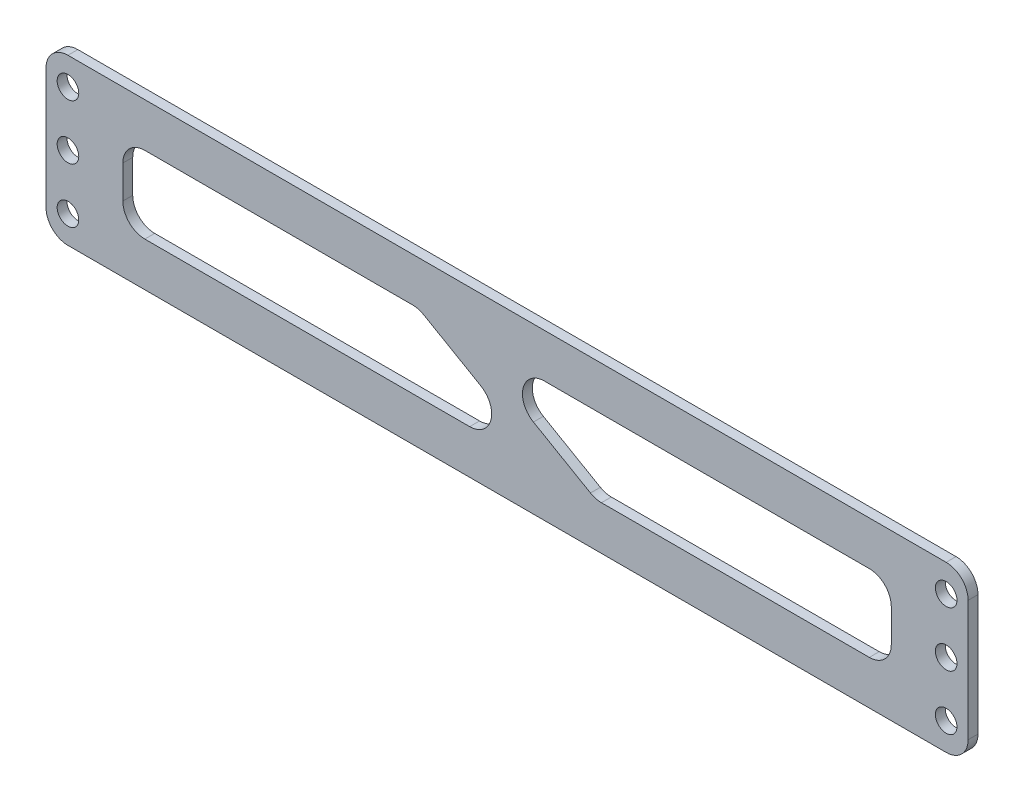
ISO-10303-21;
HEADER;
FILE_DESCRIPTION(('STEP AP214'),'2;1');
FILE_NAME('part.step','',(''),(''),'','','');
FILE_SCHEMA(('AUTOMOTIVE_DESIGN { 1 0 10303 214 1 1 1 1 }'));
ENDSEC;
DATA;
#1=APPLICATION_CONTEXT('core data for automotive mechanical design processes');
#2=APPLICATION_PROTOCOL_DEFINITION('international standard','automotive_design',2000,#1);
#3=PRODUCT_CONTEXT('',#1,'mechanical');
#4=PRODUCT('Part','Part','',(#3));
#5=PRODUCT_RELATED_PRODUCT_CATEGORY('part','',(#4));
#6=PRODUCT_DEFINITION_FORMATION('','',#4);
#7=PRODUCT_DEFINITION_CONTEXT('part definition',#1,'design');
#8=PRODUCT_DEFINITION('design','',#6,#7);
#9=PRODUCT_DEFINITION_SHAPE('','',#8);
#10=(LENGTH_UNIT() NAMED_UNIT(*) SI_UNIT(.MILLI.,.METRE.));
#11=(NAMED_UNIT(*) PLANE_ANGLE_UNIT() SI_UNIT($,.RADIAN.));
#12=(NAMED_UNIT(*) SI_UNIT($,.STERADIAN.) SOLID_ANGLE_UNIT());
#13=UNCERTAINTY_MEASURE_WITH_UNIT(LENGTH_MEASURE(1.E-05),#10,'distance_accuracy_value','');
#14=(GEOMETRIC_REPRESENTATION_CONTEXT(3) GLOBAL_UNCERTAINTY_ASSIGNED_CONTEXT((#13)) GLOBAL_UNIT_ASSIGNED_CONTEXT((#10,
#11,#12)) REPRESENTATION_CONTEXT('',''));
#15=CARTESIAN_POINT('',(0.,0.,0.));
#16=DIRECTION('',(0.,0.,1.));
#17=DIRECTION('',(1.,0.,0.));
#18=AXIS2_PLACEMENT_3D('',#15,#16,#17);
#19=CARTESIAN_POINT('',(210.82,788.67,2.286));
#20=DIRECTION('',(0.,0.,-1.));
#21=DIRECTION('',(-1.,0.,0.));
#22=AXIS2_PLACEMENT_3D('',#19,#20,#21);
#23=PLANE('',#22);
#24=CARTESIAN_POINT('',(17.78,770.89,2.286));
#25=DIRECTION('',(0.,0.,1.));
#26=DIRECTION('',(-1.,0.,0.));
#27=AXIS2_PLACEMENT_3D('',#24,#25,#26);
#28=CIRCLE('',#27,5.07999999999993);
#29=CARTESIAN_POINT('',(12.7,770.89,2.286));
#30=VERTEX_POINT('',#29);
#31=CARTESIAN_POINT('',(17.78,765.81,2.286));
#32=VERTEX_POINT('',#31);
#33=EDGE_CURVE('E204',#30,#32,#28,.T.);
#34=ORIENTED_EDGE('',*,*,#33,.F.);
#35=DIRECTION('',(0.,-1.,0.));
#36=VECTOR('',#35,1.);
#37=CARTESIAN_POINT('',(12.7,770.89,2.286));
#38=LINE('',#37,#36);
#39=CARTESIAN_POINT('',(12.7,778.51,2.286));
#40=VERTEX_POINT('',#39);
#41=EDGE_CURVE('E250',#40,#30,#38,.T.);
#42=ORIENTED_EDGE('',*,*,#41,.F.);
#43=CARTESIAN_POINT('',(17.78,778.51,2.286));
#44=DIRECTION('',(0.,0.,1.));
#45=DIRECTION('',(1.,0.,0.));
#46=AXIS2_PLACEMENT_3D('',#43,#44,#45);
#47=CIRCLE('',#46,5.07999999999999);
#48=CARTESIAN_POINT('',(17.78,783.59,2.286));
#49=VERTEX_POINT('',#48);
#50=EDGE_CURVE('E246',#49,#40,#47,.T.);
#51=ORIENTED_EDGE('',*,*,#50,.F.);
#52=DIRECTION('',(-1.,0.,0.));
#53=VECTOR('',#52,1.);
#54=CARTESIAN_POINT('',(17.78,783.59,2.286));
#55=LINE('',#54,#53);
#56=CARTESIAN_POINT('',(79.76088636345,783.59,2.286));
#57=VERTEX_POINT('',#56);
#58=EDGE_CURVE('E243',#57,#49,#55,.T.);
#59=ORIENTED_EDGE('',*,*,#58,.F.);
#60=CARTESIAN_POINT('',(79.76088636345,778.51,2.286));
#61=DIRECTION('',(0.,0.,1.));
#62=DIRECTION('',(1.,0.,0.));
#63=AXIS2_PLACEMENT_3D('',#60,#61,#62);
#64=CIRCLE('',#63,5.07999999999991);
#65=CARTESIAN_POINT('',(82.3008863634499,782.909409051225,2.286));
#66=VERTEX_POINT('',#65);
#67=EDGE_CURVE('E240',#66,#57,#64,.T.);
#68=ORIENTED_EDGE('',*,*,#67,.F.);
#69=DIRECTION('',(-0.86602540378445,0.499999999999981,0.));
#70=VECTOR('',#69,1.);
#71=CARTESIAN_POINT('',(82.3008863634499,782.909409051225,2.286));
#72=LINE('',#71,#70);
#73=CARTESIAN_POINT('',(95.4991135171253,775.289409051225,2.286));
#74=VERTEX_POINT('',#73);
#75=EDGE_CURVE('E234',#74,#66,#72,.T.);
#76=ORIENTED_EDGE('',*,*,#75,.F.);
#77=CARTESIAN_POINT('',(92.9591135171253,770.89,2.286));
#78=DIRECTION('',(0.,0.,1.));
#79=DIRECTION('',(-1.,0.,0.));
#80=AXIS2_PLACEMENT_3D('',#77,#78,#79);
#81=CIRCLE('',#80,5.08000000000009);
#82=CARTESIAN_POINT('',(92.9591135171253,765.81,2.286));
#83=VERTEX_POINT('',#82);
#84=EDGE_CURVE('E230',#83,#74,#81,.T.);
#85=ORIENTED_EDGE('',*,*,#84,.F.);
#86=DIRECTION('',(1.,0.,0.));
#87=VECTOR('',#86,1.);
#88=CARTESIAN_POINT('',(92.9591135171253,765.81,2.286));
#89=LINE('',#88,#87);
#90=EDGE_CURVE('E215',#32,#83,#89,.T.);
#91=ORIENTED_EDGE('',*,*,#90,.F.);
#92=EDGE_LOOP('',(#34,#42,#51,#59,#68,#76,#85,#91));
#93=FACE_BOUND('',#92,.T.);
#94=CARTESIAN_POINT('',(203.2,787.4,2.286));
#95=DIRECTION('',(0.,0.,1.));
#96=DIRECTION('',(1.,0.,0.));
#97=AXIS2_PLACEMENT_3D('',#94,#95,#96);
#98=CIRCLE('',#97,2.49999999999978);
#99=CARTESIAN_POINT('',(205.7,787.4,2.286));
#100=VERTEX_POINT('',#99);
#101=EDGE_CURVE('E384',#100,#100,#98,.T.);
#102=ORIENTED_EDGE('',*,*,#101,.F.);
#103=EDGE_LOOP('',(#102));
#104=FACE_BOUND('',#103,.T.);
#105=CARTESIAN_POINT('',(203.2,774.7,2.286));
#106=DIRECTION('',(0.,0.,1.));
#107=DIRECTION('',(1.,0.,0.));
#108=AXIS2_PLACEMENT_3D('',#105,#106,#107);
#109=CIRCLE('',#108,2.49999999999986);
#110=CARTESIAN_POINT('',(205.7,774.7,2.286));
#111=VERTEX_POINT('',#110);
#112=EDGE_CURVE('E392',#111,#111,#109,.T.);
#113=ORIENTED_EDGE('',*,*,#112,.F.);
#114=EDGE_LOOP('',(#113));
#115=FACE_BOUND('',#114,.T.);
#116=CARTESIAN_POINT('',(203.2,762.,2.286));
#117=DIRECTION('',(0.,0.,1.));
#118=DIRECTION('',(1.,0.,0.));
#119=AXIS2_PLACEMENT_3D('',#116,#117,#118);
#120=CIRCLE('',#119,2.49999999999986);
#121=CARTESIAN_POINT('',(205.7,762.,2.286));
#122=VERTEX_POINT('',#121);
#123=EDGE_CURVE('E400',#122,#122,#120,.T.);
#124=ORIENTED_EDGE('',*,*,#123,.F.);
#125=EDGE_LOOP('',(#124));
#126=FACE_BOUND('',#125,.T.);
#127=CARTESIAN_POINT('',(0.,787.4,2.286));
#128=DIRECTION('',(0.,0.,1.));
#129=DIRECTION('',(1.,0.,0.));
#130=AXIS2_PLACEMENT_3D('',#127,#128,#129);
#131=CIRCLE('',#130,2.4999999999997);
#132=CARTESIAN_POINT('',(2.4999999999997,787.4,2.286));
#133=VERTEX_POINT('',#132);
#134=EDGE_CURVE('E408',#133,#133,#131,.T.);
#135=ORIENTED_EDGE('',*,*,#134,.F.);
#136=EDGE_LOOP('',(#135));
#137=FACE_BOUND('',#136,.T.);
#138=CARTESIAN_POINT('',(0.,774.7,2.286));
#139=DIRECTION('',(0.,0.,1.));
#140=DIRECTION('',(1.,0.,0.));
#141=AXIS2_PLACEMENT_3D('',#138,#139,#140);
#142=CIRCLE('',#141,2.49999999999991);
#143=CARTESIAN_POINT('',(2.49999999999991,774.7,2.286));
#144=VERTEX_POINT('',#143);
#145=EDGE_CURVE('E416',#144,#144,#142,.T.);
#146=ORIENTED_EDGE('',*,*,#145,.F.);
#147=EDGE_LOOP('',(#146));
#148=FACE_BOUND('',#147,.T.);
#149=CARTESIAN_POINT('',(0.,762.,2.286));
#150=DIRECTION('',(0.,0.,1.));
#151=DIRECTION('',(1.,0.,0.));
#152=AXIS2_PLACEMENT_3D('',#149,#150,#151);
#153=CIRCLE('',#152,2.49999999999992);
#154=CARTESIAN_POINT('',(2.49999999999992,762.,2.286));
#155=VERTEX_POINT('',#154);
#156=EDGE_CURVE('E424',#155,#155,#153,.T.);
#157=ORIENTED_EDGE('',*,*,#156,.F.);
#158=EDGE_LOOP('',(#157));
#159=FACE_BOUND('',#158,.T.);
#160=CARTESIAN_POINT('',(185.42,778.51,2.286));
#161=DIRECTION('',(0.,0.,1.));
#162=DIRECTION('',(-1.,0.,0.));
#163=AXIS2_PLACEMENT_3D('',#160,#161,#162);
#164=CIRCLE('',#163,5.08000000000004);
#165=CARTESIAN_POINT('',(190.5,778.51,2.286));
#166=VERTEX_POINT('',#165);
#167=CARTESIAN_POINT('',(185.42,783.59,2.286));
#168=VERTEX_POINT('',#167);
#169=EDGE_CURVE('E301',#166,#168,#164,.T.);
#170=ORIENTED_EDGE('',*,*,#169,.F.);
#171=DIRECTION('',(0.,1.,0.));
#172=VECTOR('',#171,1.);
#173=CARTESIAN_POINT('',(190.5,778.51,2.286));
#174=LINE('',#173,#172);
#175=CARTESIAN_POINT('',(190.5,770.89,2.286));
#176=VERTEX_POINT('',#175);
#177=EDGE_CURVE('E324',#176,#166,#174,.T.);
#178=ORIENTED_EDGE('',*,*,#177,.F.);
#179=CARTESIAN_POINT('',(185.42,770.89,2.286));
#180=DIRECTION('',(0.,0.,1.));
#181=DIRECTION('',(-1.,0.,0.));
#182=AXIS2_PLACEMENT_3D('',#179,#180,#181);
#183=CIRCLE('',#182,5.07999999999999);
#184=CARTESIAN_POINT('',(185.42,765.81,2.286));
#185=VERTEX_POINT('',#184);
#186=EDGE_CURVE('E320',#185,#176,#183,.T.);
#187=ORIENTED_EDGE('',*,*,#186,.F.);
#188=DIRECTION('',(1.,0.,0.));
#189=VECTOR('',#188,1.);
#190=CARTESIAN_POINT('',(185.42,765.81,2.286));
#191=LINE('',#190,#189);
#192=CARTESIAN_POINT('',(123.439113517125,765.81,2.286));
#193=VERTEX_POINT('',#192);
#194=EDGE_CURVE('E317',#193,#185,#191,.T.);
#195=ORIENTED_EDGE('',*,*,#194,.F.);
#196=CARTESIAN_POINT('',(123.439113517125,770.89,2.286));
#197=DIRECTION('',(0.,0.,1.));
#198=DIRECTION('',(1.,0.,0.));
#199=AXIS2_PLACEMENT_3D('',#196,#197,#198);
#200=CIRCLE('',#199,5.07999999999991);
#201=CARTESIAN_POINT('',(120.899113517126,766.490590948775,2.286));
#202=VERTEX_POINT('',#201);
#203=EDGE_CURVE('E314',#202,#193,#200,.T.);
#204=ORIENTED_EDGE('',*,*,#203,.F.);
#205=DIRECTION('',(0.866025403784442,-0.499999999999994,0.));
#206=VECTOR('',#205,1.);
#207=CARTESIAN_POINT('',(107.70088636345,774.110590948775,2.286));
#208=LINE('',#207,#206);
#209=CARTESIAN_POINT('',(107.70088636345,774.110590948775,2.286));
#210=VERTEX_POINT('',#209);
#211=EDGE_CURVE('E311',#210,#202,#208,.T.);
#212=ORIENTED_EDGE('',*,*,#211,.F.);
#213=CARTESIAN_POINT('',(110.24088636345,778.51,2.286));
#214=DIRECTION('',(0.,0.,1.));
#215=DIRECTION('',(-1.,0.,0.));
#216=AXIS2_PLACEMENT_3D('',#213,#214,#215);
#217=CIRCLE('',#216,5.07999999999997);
#218=CARTESIAN_POINT('',(110.24088636345,783.59,2.286));
#219=VERTEX_POINT('',#218);
#220=EDGE_CURVE('E308',#219,#210,#217,.T.);
#221=ORIENTED_EDGE('',*,*,#220,.F.);
#222=DIRECTION('',(-1.,0.,0.));
#223=VECTOR('',#222,1.);
#224=CARTESIAN_POINT('',(110.24088636345,783.59,2.286));
#225=LINE('',#224,#223);
#226=EDGE_CURVE('E304',#168,#219,#225,.T.);
#227=ORIENTED_EDGE('',*,*,#226,.F.);
#228=EDGE_LOOP('',(#170,#178,#187,#195,#204,#212,#221,#227));
#229=FACE_BOUND('',#228,.T.);
#230=DIRECTION('',(0.,1.,0.));
#231=VECTOR('',#230,1.);
#232=CARTESIAN_POINT('',(-5.08,0.,2.286));
#233=LINE('',#232,#231);
#234=CARTESIAN_POINT('',(-5.08,760.73,2.286));
#235=VERTEX_POINT('',#234);
#236=CARTESIAN_POINT('',(-5.08,788.67,2.286));
#237=VERTEX_POINT('',#236);
#238=EDGE_CURVE('E519',#235,#237,#233,.T.);
#239=ORIENTED_EDGE('',*,*,#238,.F.);
#240=CARTESIAN_POINT('',(0.,760.73,2.286));
#241=DIRECTION('',(0.,0.,-1.));
#242=DIRECTION('',(-1.,0.,0.));
#243=AXIS2_PLACEMENT_3D('',#240,#241,#242);
#244=CIRCLE('',#243,5.08);
#245=CARTESIAN_POINT('',(0.,755.65,2.286));
#246=VERTEX_POINT('',#245);
#247=EDGE_CURVE('E479',#235,#246,#244,.F.);
#248=ORIENTED_EDGE('',*,*,#247,.T.);
#249=DIRECTION('',(1.,0.,0.));
#250=VECTOR('',#249,1.);
#251=CARTESIAN_POINT('',(-7.62,755.65,2.286));
#252=LINE('',#251,#250);
#253=CARTESIAN_POINT('',(203.2,755.65,2.286));
#254=VERTEX_POINT('',#253);
#255=EDGE_CURVE('E435',#246,#254,#252,.T.);
#256=ORIENTED_EDGE('',*,*,#255,.T.);
#257=CARTESIAN_POINT('',(203.2,760.73,2.286));
#258=DIRECTION('',(0.,0.,-1.));
#259=DIRECTION('',(-1.,0.,0.));
#260=AXIS2_PLACEMENT_3D('',#257,#258,#259);
#261=CIRCLE('',#260,5.08);
#262=CARTESIAN_POINT('',(208.28,760.73,2.286));
#263=VERTEX_POINT('',#262);
#264=EDGE_CURVE('E473',#254,#263,#261,.F.);
#265=ORIENTED_EDGE('',*,*,#264,.T.);
#266=DIRECTION('',(0.,1.,0.));
#267=VECTOR('',#266,1.);
#268=CARTESIAN_POINT('',(208.28,0.,2.286));
#269=LINE('',#268,#267);
#270=CARTESIAN_POINT('',(208.28,788.67,2.286));
#271=VERTEX_POINT('',#270);
#272=EDGE_CURVE('E256',#263,#271,#269,.T.);
#273=ORIENTED_EDGE('',*,*,#272,.T.);
#274=CARTESIAN_POINT('',(203.2,788.67,2.286));
#275=DIRECTION('',(0.,0.,-1.));
#276=DIRECTION('',(-1.,0.,0.));
#277=AXIS2_PLACEMENT_3D('',#274,#275,#276);
#278=CIRCLE('',#277,5.08);
#279=CARTESIAN_POINT('',(203.2,793.75,2.286));
#280=VERTEX_POINT('',#279);
#281=EDGE_CURVE('E62',#271,#280,#278,.F.);
#282=ORIENTED_EDGE('',*,*,#281,.T.);
#283=DIRECTION('',(-1.,0.,0.));
#284=VECTOR('',#283,1.);
#285=CARTESIAN_POINT('',(-7.62,793.75,2.286));
#286=LINE('',#285,#284);
#287=CARTESIAN_POINT('',(0.,793.75,2.286));
#288=VERTEX_POINT('',#287);
#289=EDGE_CURVE('E432',#280,#288,#286,.T.);
#290=ORIENTED_EDGE('',*,*,#289,.T.);
#291=CARTESIAN_POINT('',(0.,788.67,2.286));
#292=DIRECTION('',(0.,0.,-1.));
#293=DIRECTION('',(-1.,0.,0.));
#294=AXIS2_PLACEMENT_3D('',#291,#292,#293);
#295=CIRCLE('',#294,5.08);
#296=EDGE_CURVE('E476',#288,#237,#295,.F.);
#297=ORIENTED_EDGE('',*,*,#296,.T.);
#298=EDGE_LOOP('',(#239,#248,#256,#265,#273,#282,#290,#297));
#299=FACE_BOUND('',#298,.T.);
#300=ADVANCED_FACE('F39',(#93,#104,#115,#126,#137,#148,#159,#229,#299),#23,.F.);
#301=CARTESIAN_POINT('',(210.82,788.67,0.));
#302=DIRECTION('',(0.,0.,-1.));
#303=DIRECTION('',(-1.,0.,0.));
#304=AXIS2_PLACEMENT_3D('',#301,#302,#303);
#305=PLANE('',#304);
#306=DIRECTION('',(1.,0.,0.));
#307=VECTOR('',#306,1.);
#308=CARTESIAN_POINT('',(-7.62,755.65,0.));
#309=LINE('',#308,#307);
#310=CARTESIAN_POINT('',(0.,755.65,0.));
#311=VERTEX_POINT('',#310);
#312=CARTESIAN_POINT('',(203.2,755.65,0.));
#313=VERTEX_POINT('',#312);
#314=EDGE_CURVE('E436',#311,#313,#309,.T.);
#315=ORIENTED_EDGE('',*,*,#314,.F.);
#316=CARTESIAN_POINT('',(0.,760.73,0.));
#317=DIRECTION('',(0.,0.,-1.));
#318=DIRECTION('',(-1.,0.,0.));
#319=AXIS2_PLACEMENT_3D('',#316,#317,#318);
#320=CIRCLE('',#319,5.08);
#321=CARTESIAN_POINT('',(-5.08,760.73,0.));
#322=VERTEX_POINT('',#321);
#323=EDGE_CURVE('E461',#311,#322,#320,.T.);
#324=ORIENTED_EDGE('',*,*,#323,.T.);
#325=DIRECTION('',(0.,1.,0.));
#326=VECTOR('',#325,1.);
#327=CARTESIAN_POINT('',(-5.08,0.,0.));
#328=LINE('',#327,#326);
#329=CARTESIAN_POINT('',(-5.08,788.67,0.));
#330=VERTEX_POINT('',#329);
#331=EDGE_CURVE('E510',#322,#330,#328,.T.);
#332=ORIENTED_EDGE('',*,*,#331,.T.);
#333=CARTESIAN_POINT('',(0.,788.67,0.));
#334=DIRECTION('',(0.,0.,-1.));
#335=DIRECTION('',(-1.,0.,0.));
#336=AXIS2_PLACEMENT_3D('',#333,#334,#335);
#337=CIRCLE('',#336,5.08);
#338=CARTESIAN_POINT('',(0.,793.75,0.));
#339=VERTEX_POINT('',#338);
#340=EDGE_CURVE('E458',#330,#339,#337,.T.);
#341=ORIENTED_EDGE('',*,*,#340,.T.);
#342=DIRECTION('',(-1.,0.,0.));
#343=VECTOR('',#342,1.);
#344=CARTESIAN_POINT('',(-7.62,793.75,0.));
#345=LINE('',#344,#343);
#346=CARTESIAN_POINT('',(203.2,793.75,0.));
#347=VERTEX_POINT('',#346);
#348=EDGE_CURVE('E428',#347,#339,#345,.T.);
#349=ORIENTED_EDGE('',*,*,#348,.F.);
#350=CARTESIAN_POINT('',(203.2,788.67,0.));
#351=DIRECTION('',(0.,0.,-1.));
#352=DIRECTION('',(-1.,0.,0.));
#353=AXIS2_PLACEMENT_3D('',#350,#351,#352);
#354=CIRCLE('',#353,5.08);
#355=CARTESIAN_POINT('',(208.28,788.67,0.));
#356=VERTEX_POINT('',#355);
#357=EDGE_CURVE('E452',#347,#356,#354,.T.);
#358=ORIENTED_EDGE('',*,*,#357,.T.);
#359=DIRECTION('',(0.,1.,0.));
#360=VECTOR('',#359,1.);
#361=CARTESIAN_POINT('',(208.28,0.,0.));
#362=LINE('',#361,#360);
#363=CARTESIAN_POINT('',(208.28,760.73,0.));
#364=VERTEX_POINT('',#363);
#365=EDGE_CURVE('E495',#364,#356,#362,.T.);
#366=ORIENTED_EDGE('',*,*,#365,.F.);
#367=CARTESIAN_POINT('',(203.2,760.73,0.));
#368=DIRECTION('',(0.,0.,-1.));
#369=DIRECTION('',(-1.,0.,0.));
#370=AXIS2_PLACEMENT_3D('',#367,#368,#369);
#371=CIRCLE('',#370,5.08);
#372=EDGE_CURVE('E455',#364,#313,#371,.T.);
#373=ORIENTED_EDGE('',*,*,#372,.T.);
#374=EDGE_LOOP('',(#315,#324,#332,#341,#349,#358,#366,#373));
#375=FACE_BOUND('',#374,.T.);
#376=CARTESIAN_POINT('',(203.2,774.7,0.));
#377=DIRECTION('',(0.,0.,1.));
#378=DIRECTION('',(1.,0.,0.));
#379=AXIS2_PLACEMENT_3D('',#376,#377,#378);
#380=CIRCLE('',#379,2.49999999999986);
#381=CARTESIAN_POINT('',(205.7,774.7,0.));
#382=VERTEX_POINT('',#381);
#383=EDGE_CURVE('E388',#382,#382,#380,.T.);
#384=ORIENTED_EDGE('',*,*,#383,.T.);
#385=EDGE_LOOP('',(#384));
#386=FACE_BOUND('',#385,.T.);
#387=CARTESIAN_POINT('',(0.,787.4,0.));
#388=DIRECTION('',(0.,0.,1.));
#389=DIRECTION('',(1.,0.,0.));
#390=AXIS2_PLACEMENT_3D('',#387,#388,#389);
#391=CIRCLE('',#390,2.4999999999997);
#392=CARTESIAN_POINT('',(2.4999999999997,787.4,0.));
#393=VERTEX_POINT('',#392);
#394=EDGE_CURVE('E404',#393,#393,#391,.T.);
#395=ORIENTED_EDGE('',*,*,#394,.T.);
#396=EDGE_LOOP('',(#395));
#397=FACE_BOUND('',#396,.T.);
#398=CARTESIAN_POINT('',(0.,762.,0.));
#399=DIRECTION('',(0.,0.,1.));
#400=DIRECTION('',(1.,0.,0.));
#401=AXIS2_PLACEMENT_3D('',#398,#399,#400);
#402=CIRCLE('',#401,2.49999999999992);
#403=CARTESIAN_POINT('',(2.49999999999992,762.,0.));
#404=VERTEX_POINT('',#403);
#405=EDGE_CURVE('E420',#404,#404,#402,.T.);
#406=ORIENTED_EDGE('',*,*,#405,.T.);
#407=EDGE_LOOP('',(#406));
#408=FACE_BOUND('',#407,.T.);
#409=CARTESIAN_POINT('',(0.,774.7,0.));
#410=DIRECTION('',(0.,0.,1.));
#411=DIRECTION('',(1.,0.,0.));
#412=AXIS2_PLACEMENT_3D('',#409,#410,#411);
#413=CIRCLE('',#412,2.49999999999991);
#414=CARTESIAN_POINT('',(2.49999999999991,774.7,0.));
#415=VERTEX_POINT('',#414);
#416=EDGE_CURVE('E412',#415,#415,#413,.T.);
#417=ORIENTED_EDGE('',*,*,#416,.T.);
#418=EDGE_LOOP('',(#417));
#419=FACE_BOUND('',#418,.T.);
#420=CARTESIAN_POINT('',(203.2,762.,0.));
#421=DIRECTION('',(0.,0.,1.));
#422=DIRECTION('',(1.,0.,0.));
#423=AXIS2_PLACEMENT_3D('',#420,#421,#422);
#424=CIRCLE('',#423,2.49999999999986);
#425=CARTESIAN_POINT('',(205.7,762.,0.));
#426=VERTEX_POINT('',#425);
#427=EDGE_CURVE('E396',#426,#426,#424,.T.);
#428=ORIENTED_EDGE('',*,*,#427,.T.);
#429=EDGE_LOOP('',(#428));
#430=FACE_BOUND('',#429,.T.);
#431=CARTESIAN_POINT('',(203.2,787.4,0.));
#432=DIRECTION('',(0.,0.,1.));
#433=DIRECTION('',(1.,0.,0.));
#434=AXIS2_PLACEMENT_3D('',#431,#432,#433);
#435=CIRCLE('',#434,2.49999999999978);
#436=CARTESIAN_POINT('',(205.7,787.4,0.));
#437=VERTEX_POINT('',#436);
#438=EDGE_CURVE('E383',#437,#437,#435,.T.);
#439=ORIENTED_EDGE('',*,*,#438,.T.);
#440=EDGE_LOOP('',(#439));
#441=FACE_BOUND('',#440,.T.);
#442=DIRECTION('',(0.,1.,0.));
#443=VECTOR('',#442,1.);
#444=CARTESIAN_POINT('',(190.5,778.51,0.));
#445=LINE('',#444,#443);
#446=CARTESIAN_POINT('',(190.5,770.89,0.));
#447=VERTEX_POINT('',#446);
#448=CARTESIAN_POINT('',(190.5,778.51,0.));
#449=VERTEX_POINT('',#448);
#450=EDGE_CURVE('E305',#447,#449,#445,.T.);
#451=ORIENTED_EDGE('',*,*,#450,.T.);
#452=CARTESIAN_POINT('',(185.42,778.51,0.));
#453=DIRECTION('',(0.,0.,1.));
#454=DIRECTION('',(-1.,0.,0.));
#455=AXIS2_PLACEMENT_3D('',#452,#453,#454);
#456=CIRCLE('',#455,5.08000000000004);
#457=CARTESIAN_POINT('',(185.42,783.59,0.));
#458=VERTEX_POINT('',#457);
#459=EDGE_CURVE('E224',#449,#458,#456,.T.);
#460=ORIENTED_EDGE('',*,*,#459,.T.);
#461=DIRECTION('',(-1.,0.,0.));
#462=VECTOR('',#461,1.);
#463=CARTESIAN_POINT('',(110.24088636345,783.59,0.));
#464=LINE('',#463,#462);
#465=CARTESIAN_POINT('',(110.24088636345,783.59,0.));
#466=VERTEX_POINT('',#465);
#467=EDGE_CURVE('E331',#458,#466,#464,.T.);
#468=ORIENTED_EDGE('',*,*,#467,.T.);
#469=CARTESIAN_POINT('',(110.24088636345,778.51,0.));
#470=DIRECTION('',(0.,0.,1.));
#471=DIRECTION('',(-1.,0.,0.));
#472=AXIS2_PLACEMENT_3D('',#469,#470,#471);
#473=CIRCLE('',#472,5.07999999999997);
#474=CARTESIAN_POINT('',(107.70088636345,774.110590948775,0.));
#475=VERTEX_POINT('',#474);
#476=EDGE_CURVE('E335',#466,#475,#473,.T.);
#477=ORIENTED_EDGE('',*,*,#476,.T.);
#478=DIRECTION('',(0.866025403784442,-0.499999999999994,0.));
#479=VECTOR('',#478,1.);
#480=CARTESIAN_POINT('',(107.70088636345,774.110590948775,0.));
#481=LINE('',#480,#479);
#482=CARTESIAN_POINT('',(120.899113517126,766.490590948775,0.));
#483=VERTEX_POINT('',#482);
#484=EDGE_CURVE('E339',#475,#483,#481,.T.);
#485=ORIENTED_EDGE('',*,*,#484,.T.);
#486=CARTESIAN_POINT('',(123.439113517125,770.89,0.));
#487=DIRECTION('',(0.,0.,1.));
#488=DIRECTION('',(1.,0.,0.));
#489=AXIS2_PLACEMENT_3D('',#486,#487,#488);
#490=CIRCLE('',#489,5.07999999999991);
#491=CARTESIAN_POINT('',(123.439113517125,765.81,0.));
#492=VERTEX_POINT('',#491);
#493=EDGE_CURVE('E343',#483,#492,#490,.T.);
#494=ORIENTED_EDGE('',*,*,#493,.T.);
#495=DIRECTION('',(1.,0.,0.));
#496=VECTOR('',#495,1.);
#497=CARTESIAN_POINT('',(185.42,765.81,0.));
#498=LINE('',#497,#496);
#499=CARTESIAN_POINT('',(185.42,765.81,0.));
#500=VERTEX_POINT('',#499);
#501=EDGE_CURVE('E347',#492,#500,#498,.T.);
#502=ORIENTED_EDGE('',*,*,#501,.T.);
#503=CARTESIAN_POINT('',(185.42,770.89,0.));
#504=DIRECTION('',(0.,0.,1.));
#505=DIRECTION('',(-1.,0.,0.));
#506=AXIS2_PLACEMENT_3D('',#503,#504,#505);
#507=CIRCLE('',#506,5.07999999999999);
#508=EDGE_CURVE('E351',#500,#447,#507,.T.);
#509=ORIENTED_EDGE('',*,*,#508,.T.);
#510=EDGE_LOOP('',(#451,#460,#468,#477,#485,#494,#502,#509));
#511=FACE_BOUND('',#510,.T.);
#512=DIRECTION('',(0.,-1.,0.));
#513=VECTOR('',#512,1.);
#514=CARTESIAN_POINT('',(12.7,770.89,0.));
#515=LINE('',#514,#513);
#516=CARTESIAN_POINT('',(12.7,778.51,0.));
#517=VERTEX_POINT('',#516);
#518=CARTESIAN_POINT('',(12.7,770.89,0.));
#519=VERTEX_POINT('',#518);
#520=EDGE_CURVE('E216',#517,#519,#515,.T.);
#521=ORIENTED_EDGE('',*,*,#520,.T.);
#522=CARTESIAN_POINT('',(17.78,770.89,0.));
#523=DIRECTION('',(0.,0.,1.));
#524=DIRECTION('',(-1.,0.,0.));
#525=AXIS2_PLACEMENT_3D('',#522,#523,#524);
#526=CIRCLE('',#525,5.07999999999993);
#527=CARTESIAN_POINT('',(17.78,765.81,0.));
#528=VERTEX_POINT('',#527);
#529=EDGE_CURVE('E253',#519,#528,#526,.T.);
#530=ORIENTED_EDGE('',*,*,#529,.T.);
#531=DIRECTION('',(1.,0.,0.));
#532=VECTOR('',#531,1.);
#533=CARTESIAN_POINT('',(92.9591135171253,765.81,0.));
#534=LINE('',#533,#532);
#535=CARTESIAN_POINT('',(92.9591135171253,765.81,0.));
#536=VERTEX_POINT('',#535);
#537=EDGE_CURVE('E222',#528,#536,#534,.T.);
#538=ORIENTED_EDGE('',*,*,#537,.T.);
#539=CARTESIAN_POINT('',(92.9591135171253,770.89,0.));
#540=DIRECTION('',(0.,0.,1.));
#541=DIRECTION('',(-1.,0.,0.));
#542=AXIS2_PLACEMENT_3D('',#539,#540,#541);
#543=CIRCLE('',#542,5.08000000000009);
#544=CARTESIAN_POINT('',(95.4991135171253,775.289409051225,0.));
#545=VERTEX_POINT('',#544);
#546=EDGE_CURVE('E259',#536,#545,#543,.T.);
#547=ORIENTED_EDGE('',*,*,#546,.T.);
#548=DIRECTION('',(-0.86602540378445,0.499999999999981,0.));
#549=VECTOR('',#548,1.);
#550=CARTESIAN_POINT('',(82.3008863634499,782.909409051225,0.));
#551=LINE('',#550,#549);
#552=CARTESIAN_POINT('',(82.3008863634499,782.909409051225,0.));
#553=VERTEX_POINT('',#552);
#554=EDGE_CURVE('E263',#545,#553,#551,.T.);
#555=ORIENTED_EDGE('',*,*,#554,.T.);
#556=CARTESIAN_POINT('',(79.76088636345,778.51,0.));
#557=DIRECTION('',(0.,0.,1.));
#558=DIRECTION('',(1.,0.,0.));
#559=AXIS2_PLACEMENT_3D('',#556,#557,#558);
#560=CIRCLE('',#559,5.07999999999991);
#561=CARTESIAN_POINT('',(79.76088636345,783.59,0.));
#562=VERTEX_POINT('',#561);
#563=EDGE_CURVE('E267',#553,#562,#560,.T.);
#564=ORIENTED_EDGE('',*,*,#563,.T.);
#565=DIRECTION('',(-1.,0.,0.));
#566=VECTOR('',#565,1.);
#567=CARTESIAN_POINT('',(17.78,783.59,0.));
#568=LINE('',#567,#566);
#569=CARTESIAN_POINT('',(17.78,783.59,0.));
#570=VERTEX_POINT('',#569);
#571=EDGE_CURVE('E271',#562,#570,#568,.T.);
#572=ORIENTED_EDGE('',*,*,#571,.T.);
#573=CARTESIAN_POINT('',(17.78,778.51,0.));
#574=DIRECTION('',(0.,0.,1.));
#575=DIRECTION('',(1.,0.,0.));
#576=AXIS2_PLACEMENT_3D('',#573,#574,#575);
#577=CIRCLE('',#576,5.07999999999999);
#578=EDGE_CURVE('E275',#570,#517,#577,.T.);
#579=ORIENTED_EDGE('',*,*,#578,.T.);
#580=EDGE_LOOP('',(#521,#530,#538,#547,#555,#564,#572,#579));
#581=FACE_BOUND('',#580,.T.);
#582=ADVANCED_FACE('F506',(#375,#386,#397,#408,#419,#430,#441,#511,#581),#305,.T.);
#583=CARTESIAN_POINT('',(-7.62,793.75,2.286));
#584=DIRECTION('',(0.,-1.,0.));
#585=DIRECTION('',(0.,0.,-1.));
#586=AXIS2_PLACEMENT_3D('',#583,#584,#585);
#587=PLANE('',#586);
#588=ORIENTED_EDGE('',*,*,#348,.T.);
#589=DIRECTION('',(0.,0.,-1.));
#590=VECTOR('',#589,1.);
#591=CARTESIAN_POINT('',(0.,793.75,2.286));
#592=LINE('',#591,#590);
#593=EDGE_CURVE('E55',#339,#288,#592,.F.);
#594=ORIENTED_EDGE('',*,*,#593,.T.);
#595=ORIENTED_EDGE('',*,*,#289,.F.);
#596=DIRECTION('',(0.,0.,-1.));
#597=VECTOR('',#596,1.);
#598=CARTESIAN_POINT('',(203.2,793.75,2.286));
#599=LINE('',#598,#597);
#600=EDGE_CURVE('E482',#280,#347,#599,.T.);
#601=ORIENTED_EDGE('',*,*,#600,.T.);
#602=EDGE_LOOP('',(#588,#594,#595,#601));
#603=FACE_BOUND('',#602,.T.);
#604=ADVANCED_FACE('F503',(#603),#587,.F.);
#605=CARTESIAN_POINT('',(-7.62,755.65,2.286));
#606=DIRECTION('',(0.,1.,0.));
#607=DIRECTION('',(0.,0.,1.));
#608=AXIS2_PLACEMENT_3D('',#605,#606,#607);
#609=PLANE('',#608);
#610=ORIENTED_EDGE('',*,*,#255,.F.);
#611=DIRECTION('',(0.,0.,-1.));
#612=VECTOR('',#611,1.);
#613=CARTESIAN_POINT('',(0.,755.65,0.));
#614=LINE('',#613,#612);
#615=EDGE_CURVE('E448',#246,#311,#614,.T.);
#616=ORIENTED_EDGE('',*,*,#615,.T.);
#617=ORIENTED_EDGE('',*,*,#314,.T.);
#618=DIRECTION('',(0.,0.,-1.));
#619=VECTOR('',#618,1.);
#620=CARTESIAN_POINT('',(203.2,755.65,2.286));
#621=LINE('',#620,#619);
#622=EDGE_CURVE('E440',#313,#254,#621,.F.);
#623=ORIENTED_EDGE('',*,*,#622,.T.);
#624=EDGE_LOOP('',(#610,#616,#617,#623));
#625=FACE_BOUND('',#624,.T.);
#626=ADVANCED_FACE('F531',(#625),#609,.F.);
#627=CARTESIAN_POINT('',(0.,762.,2.286));
#628=DIRECTION('',(0.,0.,-1.));
#629=DIRECTION('',(-1.,0.,0.));
#630=AXIS2_PLACEMENT_3D('',#627,#628,#629);
#631=CYLINDRICAL_SURFACE('',#630,2.49999999999992);
#632=ORIENTED_EDGE('',*,*,#156,.T.);
#633=EDGE_LOOP('',(#632));
#634=FACE_BOUND('',#633,.T.);
#635=ORIENTED_EDGE('',*,*,#405,.F.);
#636=EDGE_LOOP('',(#635));
#637=FACE_BOUND('',#636,.T.);
#638=ADVANCED_FACE('F548',(#634,#637),#631,.F.);
#639=CARTESIAN_POINT('',(0.,774.7,2.286));
#640=DIRECTION('',(0.,0.,-1.));
#641=DIRECTION('',(-1.,0.,0.));
#642=AXIS2_PLACEMENT_3D('',#639,#640,#641);
#643=CYLINDRICAL_SURFACE('',#642,2.49999999999991);
#644=ORIENTED_EDGE('',*,*,#145,.T.);
#645=EDGE_LOOP('',(#644));
#646=FACE_BOUND('',#645,.T.);
#647=ORIENTED_EDGE('',*,*,#416,.F.);
#648=EDGE_LOOP('',(#647));
#649=FACE_BOUND('',#648,.T.);
#650=ADVANCED_FACE('F639',(#646,#649),#643,.F.);
#651=CARTESIAN_POINT('',(0.,787.4,2.286));
#652=DIRECTION('',(0.,0.,-1.));
#653=DIRECTION('',(-1.,0.,0.));
#654=AXIS2_PLACEMENT_3D('',#651,#652,#653);
#655=CYLINDRICAL_SURFACE('',#654,2.4999999999997);
#656=ORIENTED_EDGE('',*,*,#134,.T.);
#657=EDGE_LOOP('',(#656));
#658=FACE_BOUND('',#657,.T.);
#659=ORIENTED_EDGE('',*,*,#394,.F.);
#660=EDGE_LOOP('',(#659));
#661=FACE_BOUND('',#660,.T.);
#662=ADVANCED_FACE('F636',(#658,#661),#655,.F.);
#663=CARTESIAN_POINT('',(203.2,762.,2.286));
#664=DIRECTION('',(0.,0.,-1.));
#665=DIRECTION('',(-1.,0.,0.));
#666=AXIS2_PLACEMENT_3D('',#663,#664,#665);
#667=CYLINDRICAL_SURFACE('',#666,2.49999999999986);
#668=ORIENTED_EDGE('',*,*,#123,.T.);
#669=EDGE_LOOP('',(#668));
#670=FACE_BOUND('',#669,.T.);
#671=ORIENTED_EDGE('',*,*,#427,.F.);
#672=EDGE_LOOP('',(#671));
#673=FACE_BOUND('',#672,.T.);
#674=ADVANCED_FACE('F632',(#670,#673),#667,.F.);
#675=CARTESIAN_POINT('',(203.2,774.7,2.286));
#676=DIRECTION('',(0.,0.,-1.));
#677=DIRECTION('',(-1.,0.,0.));
#678=AXIS2_PLACEMENT_3D('',#675,#676,#677);
#679=CYLINDRICAL_SURFACE('',#678,2.49999999999986);
#680=ORIENTED_EDGE('',*,*,#112,.T.);
#681=EDGE_LOOP('',(#680));
#682=FACE_BOUND('',#681,.T.);
#683=ORIENTED_EDGE('',*,*,#383,.F.);
#684=EDGE_LOOP('',(#683));
#685=FACE_BOUND('',#684,.T.);
#686=ADVANCED_FACE('F628',(#682,#685),#679,.F.);
#687=CARTESIAN_POINT('',(203.2,787.4,2.286));
#688=DIRECTION('',(0.,0.,-1.));
#689=DIRECTION('',(-1.,0.,0.));
#690=AXIS2_PLACEMENT_3D('',#687,#688,#689);
#691=CYLINDRICAL_SURFACE('',#690,2.49999999999978);
#692=ORIENTED_EDGE('',*,*,#101,.T.);
#693=EDGE_LOOP('',(#692));
#694=FACE_BOUND('',#693,.T.);
#695=ORIENTED_EDGE('',*,*,#438,.F.);
#696=EDGE_LOOP('',(#695));
#697=FACE_BOUND('',#696,.T.);
#698=ADVANCED_FACE('F624',(#694,#697),#691,.F.);
#699=CARTESIAN_POINT('',(185.42,778.51,2.286));
#700=DIRECTION('',(0.,0.,-1.));
#701=DIRECTION('',(-1.,0.,0.));
#702=AXIS2_PLACEMENT_3D('',#699,#700,#701);
#703=CYLINDRICAL_SURFACE('',#702,5.08000000000004);
#704=ORIENTED_EDGE('',*,*,#459,.F.);
#705=DIRECTION('',(0.,0.,-1.));
#706=VECTOR('',#705,1.);
#707=CARTESIAN_POINT('',(190.5,778.51,2.286));
#708=LINE('',#707,#706);
#709=EDGE_CURVE('E327',#166,#449,#708,.T.);
#710=ORIENTED_EDGE('',*,*,#709,.F.);
#711=ORIENTED_EDGE('',*,*,#169,.T.);
#712=DIRECTION('',(0.,0.,-1.));
#713=VECTOR('',#712,1.);
#714=CARTESIAN_POINT('',(185.42,783.59,2.286));
#715=LINE('',#714,#713);
#716=EDGE_CURVE('E379',#168,#458,#715,.T.);
#717=ORIENTED_EDGE('',*,*,#716,.T.);
#718=EDGE_LOOP('',(#704,#710,#711,#717));
#719=FACE_BOUND('',#718,.T.);
#720=ADVANCED_FACE('F620',(#719),#703,.F.);
#721=CARTESIAN_POINT('',(110.24088636345,783.59,2.286));
#722=DIRECTION('',(0.,-1.,0.));
#723=DIRECTION('',(0.,0.,-1.));
#724=AXIS2_PLACEMENT_3D('',#721,#722,#723);
#725=PLANE('',#724);
#726=ORIENTED_EDGE('',*,*,#467,.F.);
#727=ORIENTED_EDGE('',*,*,#716,.F.);
#728=ORIENTED_EDGE('',*,*,#226,.T.);
#729=DIRECTION('',(0.,0.,-1.));
#730=VECTOR('',#729,1.);
#731=CARTESIAN_POINT('',(110.24088636345,783.59,2.286));
#732=LINE('',#731,#730);
#733=EDGE_CURVE('E376',#219,#466,#732,.T.);
#734=ORIENTED_EDGE('',*,*,#733,.T.);
#735=EDGE_LOOP('',(#726,#727,#728,#734));
#736=FACE_BOUND('',#735,.T.);
#737=ADVANCED_FACE('F616',(#736),#725,.T.);
#738=CARTESIAN_POINT('',(110.24088636345,778.51,2.286));
#739=DIRECTION('',(0.,0.,-1.));
#740=DIRECTION('',(-1.,0.,0.));
#741=AXIS2_PLACEMENT_3D('',#738,#739,#740);
#742=CYLINDRICAL_SURFACE('',#741,5.07999999999997);
#743=ORIENTED_EDGE('',*,*,#476,.F.);
#744=ORIENTED_EDGE('',*,*,#733,.F.);
#745=ORIENTED_EDGE('',*,*,#220,.T.);
#746=DIRECTION('',(0.,0.,-1.));
#747=VECTOR('',#746,1.);
#748=CARTESIAN_POINT('',(107.70088636345,774.110590948775,2.286));
#749=LINE('',#748,#747);
#750=EDGE_CURVE('E373',#210,#475,#749,.T.);
#751=ORIENTED_EDGE('',*,*,#750,.T.);
#752=EDGE_LOOP('',(#743,#744,#745,#751));
#753=FACE_BOUND('',#752,.T.);
#754=ADVANCED_FACE('F612',(#753),#742,.F.);
#755=CARTESIAN_POINT('',(107.70088636345,774.110590948775,2.286));
#756=DIRECTION('',(0.499999999999994,0.866025403784442,0.));
#757=DIRECTION('',(-0.866025403784442,0.499999999999994,0.));
#758=AXIS2_PLACEMENT_3D('',#755,#756,#757);
#759=PLANE('',#758);
#760=ORIENTED_EDGE('',*,*,#484,.F.);
#761=ORIENTED_EDGE('',*,*,#750,.F.);
#762=ORIENTED_EDGE('',*,*,#211,.T.);
#763=DIRECTION('',(0.,0.,-1.));
#764=VECTOR('',#763,1.);
#765=CARTESIAN_POINT('',(120.899113517126,766.490590948775,2.286));
#766=LINE('',#765,#764);
#767=EDGE_CURVE('E370',#202,#483,#766,.T.);
#768=ORIENTED_EDGE('',*,*,#767,.T.);
#769=EDGE_LOOP('',(#760,#761,#762,#768));
#770=FACE_BOUND('',#769,.T.);
#771=ADVANCED_FACE('F608',(#770),#759,.T.);
#772=CARTESIAN_POINT('',(123.439113517125,770.89,2.286));
#773=DIRECTION('',(0.,0.,-1.));
#774=DIRECTION('',(-1.,0.,0.));
#775=AXIS2_PLACEMENT_3D('',#772,#773,#774);
#776=CYLINDRICAL_SURFACE('',#775,5.07999999999991);
#777=ORIENTED_EDGE('',*,*,#493,.F.);
#778=ORIENTED_EDGE('',*,*,#767,.F.);
#779=ORIENTED_EDGE('',*,*,#203,.T.);
#780=DIRECTION('',(0.,0.,-1.));
#781=VECTOR('',#780,1.);
#782=CARTESIAN_POINT('',(123.439113517125,765.81,2.286));
#783=LINE('',#782,#781);
#784=EDGE_CURVE('E367',#193,#492,#783,.T.);
#785=ORIENTED_EDGE('',*,*,#784,.T.);
#786=EDGE_LOOP('',(#777,#778,#779,#785));
#787=FACE_BOUND('',#786,.T.);
#788=ADVANCED_FACE('F604',(#787),#776,.F.);
#789=CARTESIAN_POINT('',(185.42,765.81,2.286));
#790=DIRECTION('',(0.,1.,0.));
#791=DIRECTION('',(0.,0.,1.));
#792=AXIS2_PLACEMENT_3D('',#789,#790,#791);
#793=PLANE('',#792);
#794=ORIENTED_EDGE('',*,*,#501,.F.);
#795=ORIENTED_EDGE('',*,*,#784,.F.);
#796=ORIENTED_EDGE('',*,*,#194,.T.);
#797=DIRECTION('',(0.,0.,-1.));
#798=VECTOR('',#797,1.);
#799=CARTESIAN_POINT('',(185.42,765.81,2.286));
#800=LINE('',#799,#798);
#801=EDGE_CURVE('E364',#185,#500,#800,.T.);
#802=ORIENTED_EDGE('',*,*,#801,.T.);
#803=EDGE_LOOP('',(#794,#795,#796,#802));
#804=FACE_BOUND('',#803,.T.);
#805=ADVANCED_FACE('F600',(#804),#793,.T.);
#806=CARTESIAN_POINT('',(185.42,770.89,2.286));
#807=DIRECTION('',(0.,0.,-1.));
#808=DIRECTION('',(-1.,0.,0.));
#809=AXIS2_PLACEMENT_3D('',#806,#807,#808);
#810=CYLINDRICAL_SURFACE('',#809,5.07999999999999);
#811=ORIENTED_EDGE('',*,*,#508,.F.);
#812=ORIENTED_EDGE('',*,*,#801,.F.);
#813=ORIENTED_EDGE('',*,*,#186,.T.);
#814=DIRECTION('',(0.,0.,-1.));
#815=VECTOR('',#814,1.);
#816=CARTESIAN_POINT('',(190.5,770.89,2.286));
#817=LINE('',#816,#815);
#818=EDGE_CURVE('E361',#176,#447,#817,.T.);
#819=ORIENTED_EDGE('',*,*,#818,.T.);
#820=EDGE_LOOP('',(#811,#812,#813,#819));
#821=FACE_BOUND('',#820,.T.);
#822=ADVANCED_FACE('F596',(#821),#810,.F.);
#823=CARTESIAN_POINT('',(190.5,778.51,2.286));
#824=DIRECTION('',(-1.,0.,0.));
#825=DIRECTION('',(0.,0.,1.));
#826=AXIS2_PLACEMENT_3D('',#823,#824,#825);
#827=PLANE('',#826);
#828=ORIENTED_EDGE('',*,*,#450,.F.);
#829=ORIENTED_EDGE('',*,*,#818,.F.);
#830=ORIENTED_EDGE('',*,*,#177,.T.);
#831=ORIENTED_EDGE('',*,*,#709,.T.);
#832=EDGE_LOOP('',(#828,#829,#830,#831));
#833=FACE_BOUND('',#832,.T.);
#834=ADVANCED_FACE('F593',(#833),#827,.T.);
#835=CARTESIAN_POINT('',(17.78,770.89,2.286));
#836=DIRECTION('',(0.,0.,-1.));
#837=DIRECTION('',(-1.,0.,0.));
#838=AXIS2_PLACEMENT_3D('',#835,#836,#837);
#839=CYLINDRICAL_SURFACE('',#838,5.07999999999993);
#840=ORIENTED_EDGE('',*,*,#529,.F.);
#841=DIRECTION('',(0.,0.,-1.));
#842=VECTOR('',#841,1.);
#843=CARTESIAN_POINT('',(12.7,770.89,2.286));
#844=LINE('',#843,#842);
#845=EDGE_CURVE('E210',#30,#519,#844,.T.);
#846=ORIENTED_EDGE('',*,*,#845,.F.);
#847=ORIENTED_EDGE('',*,*,#33,.T.);
#848=DIRECTION('',(0.,0.,-1.));
#849=VECTOR('',#848,1.);
#850=CARTESIAN_POINT('',(17.78,765.81,2.286));
#851=LINE('',#850,#849);
#852=EDGE_CURVE('E207',#32,#528,#851,.T.);
#853=ORIENTED_EDGE('',*,*,#852,.T.);
#854=EDGE_LOOP('',(#840,#846,#847,#853));
#855=FACE_BOUND('',#854,.T.);
#856=ADVANCED_FACE('F206',(#855),#839,.F.);
#857=CARTESIAN_POINT('',(92.9591135171253,765.81,2.286));
#858=DIRECTION('',(0.,1.,0.));
#859=DIRECTION('',(-1.,0.,0.));
#860=AXIS2_PLACEMENT_3D('',#857,#858,#859);
#861=PLANE('',#860);
#862=ORIENTED_EDGE('',*,*,#537,.F.);
#863=ORIENTED_EDGE('',*,*,#852,.F.);
#864=ORIENTED_EDGE('',*,*,#90,.T.);
#865=DIRECTION('',(0.,0.,-1.));
#866=VECTOR('',#865,1.);
#867=CARTESIAN_POINT('',(92.9591135171253,765.81,2.286));
#868=LINE('',#867,#866);
#869=EDGE_CURVE('E225',#83,#536,#868,.T.);
#870=ORIENTED_EDGE('',*,*,#869,.T.);
#871=EDGE_LOOP('',(#862,#863,#864,#870));
#872=FACE_BOUND('',#871,.T.);
#873=ADVANCED_FACE('F219',(#872),#861,.T.);
#874=CARTESIAN_POINT('',(92.9591135171253,770.89,2.286));
#875=DIRECTION('',(0.,0.,-1.));
#876=DIRECTION('',(-1.,0.,0.));
#877=AXIS2_PLACEMENT_3D('',#874,#875,#876);
#878=CYLINDRICAL_SURFACE('',#877,5.08000000000009);
#879=ORIENTED_EDGE('',*,*,#546,.F.);
#880=ORIENTED_EDGE('',*,*,#869,.F.);
#881=ORIENTED_EDGE('',*,*,#84,.T.);
#882=DIRECTION('',(0.,0.,-1.));
#883=VECTOR('',#882,1.);
#884=CARTESIAN_POINT('',(95.4991135171253,775.289409051225,2.286));
#885=LINE('',#884,#883);
#886=EDGE_CURVE('E296',#74,#545,#885,.T.);
#887=ORIENTED_EDGE('',*,*,#886,.T.);
#888=EDGE_LOOP('',(#879,#880,#881,#887));
#889=FACE_BOUND('',#888,.T.);
#890=ADVANCED_FACE('F584',(#889),#878,.F.);
#891=CARTESIAN_POINT('',(82.3008863634499,782.909409051225,2.286));
#892=DIRECTION('',(-0.499999999999981,-0.86602540378445,0.));
#893=DIRECTION('',(0.86602540378445,-0.499999999999981,0.));
#894=AXIS2_PLACEMENT_3D('',#891,#892,#893);
#895=PLANE('',#894);
#896=ORIENTED_EDGE('',*,*,#554,.F.);
#897=ORIENTED_EDGE('',*,*,#886,.F.);
#898=ORIENTED_EDGE('',*,*,#75,.T.);
#899=DIRECTION('',(0.,0.,-1.));
#900=VECTOR('',#899,1.);
#901=CARTESIAN_POINT('',(82.3008863634499,782.909409051225,2.286));
#902=LINE('',#901,#900);
#903=EDGE_CURVE('E293',#66,#553,#902,.T.);
#904=ORIENTED_EDGE('',*,*,#903,.T.);
#905=EDGE_LOOP('',(#896,#897,#898,#904));
#906=FACE_BOUND('',#905,.T.);
#907=ADVANCED_FACE('F580',(#906),#895,.T.);
#908=CARTESIAN_POINT('',(79.76088636345,778.51,2.286));
#909=DIRECTION('',(0.,0.,-1.));
#910=DIRECTION('',(-1.,0.,0.));
#911=AXIS2_PLACEMENT_3D('',#908,#909,#910);
#912=CYLINDRICAL_SURFACE('',#911,5.07999999999991);
#913=ORIENTED_EDGE('',*,*,#563,.F.);
#914=ORIENTED_EDGE('',*,*,#903,.F.);
#915=ORIENTED_EDGE('',*,*,#67,.T.);
#916=DIRECTION('',(0.,0.,-1.));
#917=VECTOR('',#916,1.);
#918=CARTESIAN_POINT('',(79.76088636345,783.59,2.286));
#919=LINE('',#918,#917);
#920=EDGE_CURVE('E290',#57,#562,#919,.T.);
#921=ORIENTED_EDGE('',*,*,#920,.T.);
#922=EDGE_LOOP('',(#913,#914,#915,#921));
#923=FACE_BOUND('',#922,.T.);
#924=ADVANCED_FACE('F576',(#923),#912,.F.);
#925=CARTESIAN_POINT('',(17.78,783.59,2.286));
#926=DIRECTION('',(0.,-1.,0.));
#927=DIRECTION('',(0.,0.,-1.));
#928=AXIS2_PLACEMENT_3D('',#925,#926,#927);
#929=PLANE('',#928);
#930=ORIENTED_EDGE('',*,*,#571,.F.);
#931=ORIENTED_EDGE('',*,*,#920,.F.);
#932=ORIENTED_EDGE('',*,*,#58,.T.);
#933=DIRECTION('',(0.,0.,-1.));
#934=VECTOR('',#933,1.);
#935=CARTESIAN_POINT('',(17.78,783.59,2.286));
#936=LINE('',#935,#934);
#937=EDGE_CURVE('E287',#49,#570,#936,.T.);
#938=ORIENTED_EDGE('',*,*,#937,.T.);
#939=EDGE_LOOP('',(#930,#931,#932,#938));
#940=FACE_BOUND('',#939,.T.);
#941=ADVANCED_FACE('F572',(#940),#929,.T.);
#942=CARTESIAN_POINT('',(17.78,778.51,2.286));
#943=DIRECTION('',(0.,0.,-1.));
#944=DIRECTION('',(-1.,0.,0.));
#945=AXIS2_PLACEMENT_3D('',#942,#943,#944);
#946=CYLINDRICAL_SURFACE('',#945,5.07999999999999);
#947=ORIENTED_EDGE('',*,*,#578,.F.);
#948=ORIENTED_EDGE('',*,*,#937,.F.);
#949=ORIENTED_EDGE('',*,*,#50,.T.);
#950=DIRECTION('',(0.,0.,-1.));
#951=VECTOR('',#950,1.);
#952=CARTESIAN_POINT('',(12.7,778.51,2.286));
#953=LINE('',#952,#951);
#954=EDGE_CURVE('E284',#40,#517,#953,.T.);
#955=ORIENTED_EDGE('',*,*,#954,.T.);
#956=EDGE_LOOP('',(#947,#948,#949,#955));
#957=FACE_BOUND('',#956,.T.);
#958=ADVANCED_FACE('F568',(#957),#946,.F.);
#959=CARTESIAN_POINT('',(12.7,770.89,2.286));
#960=DIRECTION('',(1.,0.,0.));
#961=DIRECTION('',(0.,0.,-1.));
#962=AXIS2_PLACEMENT_3D('',#959,#960,#961);
#963=PLANE('',#962);
#964=ORIENTED_EDGE('',*,*,#520,.F.);
#965=ORIENTED_EDGE('',*,*,#954,.F.);
#966=ORIENTED_EDGE('',*,*,#41,.T.);
#967=ORIENTED_EDGE('',*,*,#845,.T.);
#968=EDGE_LOOP('',(#964,#965,#966,#967));
#969=FACE_BOUND('',#968,.T.);
#970=ADVANCED_FACE('F563',(#969),#963,.T.);
#971=CARTESIAN_POINT('',(-5.08,0.,2.286));
#972=DIRECTION('',(-1.,0.,0.));
#973=DIRECTION('',(0.,0.,1.));
#974=AXIS2_PLACEMENT_3D('',#971,#972,#973);
#975=PLANE('',#974);
#976=ORIENTED_EDGE('',*,*,#331,.F.);
#977=DIRECTION('',(0.,0.,-1.));
#978=VECTOR('',#977,1.);
#979=CARTESIAN_POINT('',(-5.08,760.73,2.286));
#980=LINE('',#979,#978);
#981=EDGE_CURVE('E468',#322,#235,#980,.F.);
#982=ORIENTED_EDGE('',*,*,#981,.T.);
#983=ORIENTED_EDGE('',*,*,#238,.T.);
#984=DIRECTION('',(0.,0.,-1.));
#985=VECTOR('',#984,1.);
#986=CARTESIAN_POINT('',(-5.08,788.67,0.));
#987=LINE('',#986,#985);
#988=EDGE_CURVE('E464',#237,#330,#987,.T.);
#989=ORIENTED_EDGE('',*,*,#988,.T.);
#990=EDGE_LOOP('',(#976,#982,#983,#989));
#991=FACE_BOUND('',#990,.T.);
#992=ADVANCED_FACE('F517',(#991),#975,.T.);
#993=CARTESIAN_POINT('',(208.28,0.,2.286));
#994=DIRECTION('',(-1.,0.,0.));
#995=DIRECTION('',(0.,0.,1.));
#996=AXIS2_PLACEMENT_3D('',#993,#994,#995);
#997=PLANE('',#996);
#998=ORIENTED_EDGE('',*,*,#272,.F.);
#999=DIRECTION('',(0.,0.,-1.));
#1000=VECTOR('',#999,1.);
#1001=CARTESIAN_POINT('',(208.28,760.73,2.286));
#1002=LINE('',#1001,#1000);
#1003=EDGE_CURVE('E11',#263,#364,#1002,.T.);
#1004=ORIENTED_EDGE('',*,*,#1003,.T.);
#1005=ORIENTED_EDGE('',*,*,#365,.T.);
#1006=DIRECTION('',(0.,0.,-1.));
#1007=VECTOR('',#1006,1.);
#1008=CARTESIAN_POINT('',(208.28,788.67,2.286));
#1009=LINE('',#1008,#1007);
#1010=EDGE_CURVE('E48',#356,#271,#1009,.F.);
#1011=ORIENTED_EDGE('',*,*,#1010,.T.);
#1012=EDGE_LOOP('',(#998,#1004,#1005,#1011));
#1013=FACE_BOUND('',#1012,.T.);
#1014=ADVANCED_FACE('F492',(#1013),#997,.F.);
#1015=CARTESIAN_POINT('',(0.,760.73,2.286));
#1016=DIRECTION('',(0.,0.,1.));
#1017=DIRECTION('',(1.,0.,0.));
#1018=AXIS2_PLACEMENT_3D('',#1015,#1016,#1017);
#1019=CYLINDRICAL_SURFACE('',#1018,5.08);
#1020=ORIENTED_EDGE('',*,*,#247,.F.);
#1021=ORIENTED_EDGE('',*,*,#981,.F.);
#1022=ORIENTED_EDGE('',*,*,#323,.F.);
#1023=ORIENTED_EDGE('',*,*,#615,.F.);
#1024=EDGE_LOOP('',(#1020,#1021,#1022,#1023));
#1025=FACE_BOUND('',#1024,.T.);
#1026=ADVANCED_FACE('F529',(#1025),#1019,.T.);
#1027=CARTESIAN_POINT('',(0.,788.67,2.286));
#1028=DIRECTION('',(0.,0.,1.));
#1029=DIRECTION('',(1.,0.,0.));
#1030=AXIS2_PLACEMENT_3D('',#1027,#1028,#1029);
#1031=CYLINDRICAL_SURFACE('',#1030,5.08);
#1032=ORIENTED_EDGE('',*,*,#296,.F.);
#1033=ORIENTED_EDGE('',*,*,#593,.F.);
#1034=ORIENTED_EDGE('',*,*,#340,.F.);
#1035=ORIENTED_EDGE('',*,*,#988,.F.);
#1036=EDGE_LOOP('',(#1032,#1033,#1034,#1035));
#1037=FACE_BOUND('',#1036,.T.);
#1038=ADVANCED_FACE('F514',(#1037),#1031,.T.);
#1039=CARTESIAN_POINT('',(203.2,760.73,2.286));
#1040=DIRECTION('',(0.,0.,-1.));
#1041=DIRECTION('',(-1.,0.,0.));
#1042=AXIS2_PLACEMENT_3D('',#1039,#1040,#1041);
#1043=CYLINDRICAL_SURFACE('',#1042,5.08);
#1044=ORIENTED_EDGE('',*,*,#264,.F.);
#1045=ORIENTED_EDGE('',*,*,#622,.F.);
#1046=ORIENTED_EDGE('',*,*,#372,.F.);
#1047=ORIENTED_EDGE('',*,*,#1003,.F.);
#1048=EDGE_LOOP('',(#1044,#1045,#1046,#1047));
#1049=FACE_BOUND('',#1048,.T.);
#1050=ADVANCED_FACE('F534',(#1049),#1043,.T.);
#1051=CARTESIAN_POINT('',(203.2,788.67,2.286));
#1052=DIRECTION('',(0.,0.,-1.));
#1053=DIRECTION('',(-1.,0.,0.));
#1054=AXIS2_PLACEMENT_3D('',#1051,#1052,#1053);
#1055=CYLINDRICAL_SURFACE('',#1054,5.08);
#1056=ORIENTED_EDGE('',*,*,#281,.F.);
#1057=ORIENTED_EDGE('',*,*,#1010,.F.);
#1058=ORIENTED_EDGE('',*,*,#357,.F.);
#1059=ORIENTED_EDGE('',*,*,#600,.F.);
#1060=EDGE_LOOP('',(#1056,#1057,#1058,#1059));
#1061=FACE_BOUND('',#1060,.T.);
#1062=ADVANCED_FACE('F41',(#1061),#1055,.T.);
#1063=CLOSED_SHELL('',(#300,#582,#604,#626,#638,#650,#662,#674,#686,#698,#720,#737,#754,#771,
#788,#805,#822,#834,#856,#873,#890,#907,#924,#941,#958,#970,#992,#1014,#1026,#1038,#1050,#1062));
#1064=MANIFOLD_SOLID_BREP('B2',#1063);
#1065=ADVANCED_BREP_SHAPE_REPRESENTATION('',(#18,#1064),#14);
#1066=SHAPE_DEFINITION_REPRESENTATION(#9,#1065);
ENDSEC;
END-ISO-10303-21;
